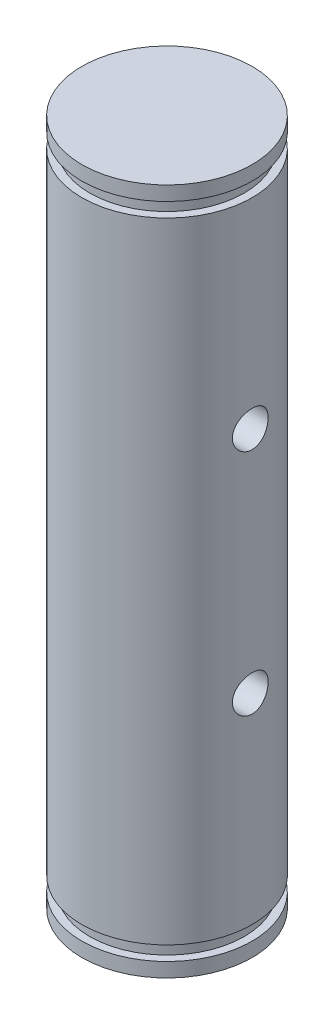
ISO-10303-21;
HEADER;
FILE_DESCRIPTION(('STEP AP214'),'2;1');
FILE_NAME('part.step','',(''),(''),'','','');
FILE_SCHEMA(('AUTOMOTIVE_DESIGN { 1 0 10303 214 1 1 1 1 }'));
ENDSEC;
DATA;
#1=APPLICATION_CONTEXT('core data for automotive mechanical design processes');
#2=APPLICATION_PROTOCOL_DEFINITION('international standard','automotive_design',2000,#1);
#3=PRODUCT_CONTEXT('',#1,'mechanical');
#4=PRODUCT('Part','Part','',(#3));
#5=PRODUCT_RELATED_PRODUCT_CATEGORY('part','',(#4));
#6=PRODUCT_DEFINITION_FORMATION('','',#4);
#7=PRODUCT_DEFINITION_CONTEXT('part definition',#1,'design');
#8=PRODUCT_DEFINITION('design','',#6,#7);
#9=PRODUCT_DEFINITION_SHAPE('','',#8);
#10=(LENGTH_UNIT() NAMED_UNIT(*) SI_UNIT(.MILLI.,.METRE.));
#11=(NAMED_UNIT(*) PLANE_ANGLE_UNIT() SI_UNIT($,.RADIAN.));
#12=(NAMED_UNIT(*) SI_UNIT($,.STERADIAN.) SOLID_ANGLE_UNIT());
#13=UNCERTAINTY_MEASURE_WITH_UNIT(LENGTH_MEASURE(1.E-05),#10,'distance_accuracy_value','');
#14=(GEOMETRIC_REPRESENTATION_CONTEXT(3) GLOBAL_UNCERTAINTY_ASSIGNED_CONTEXT((#13)) GLOBAL_UNIT_ASSIGNED_CONTEXT((#10,
#11,#12)) REPRESENTATION_CONTEXT('',''));
#15=CARTESIAN_POINT('',(0.,0.,0.));
#16=DIRECTION('',(0.,0.,1.));
#17=DIRECTION('',(1.,0.,0.));
#18=AXIS2_PLACEMENT_3D('',#15,#16,#17);
#19=CARTESIAN_POINT('',(5.9,22.,0.));
#20=DIRECTION('',(0.,-1.,0.));
#21=DIRECTION('',(0.,0.,-1.));
#22=AXIS2_PLACEMENT_3D('',#19,#20,#21);
#23=CYLINDRICAL_SURFACE('',#22,5.95);
#24=CARTESIAN_POINT('',(11.85,-9.24999999999999,0.));
#25=CARTESIAN_POINT('',(11.8499987153382,-9.24999754004047,0.0693956953655164));
#26=CARTESIAN_POINT('',(11.8487735466216,-9.24420156627658,0.138821751509415));
#27=CARTESIAN_POINT('',(11.8440043644741,-9.22119220251964,0.275706382210338));
#28=CARTESIAN_POINT('',(11.840458606665,-9.20397022350697,0.343163436798146));
#29=CARTESIAN_POINT('',(11.8314435789986,-9.15866845214247,0.474111605385649));
#30=CARTESIAN_POINT('',(11.825976240549,-9.13059955936681,0.537606626500025));
#31=CARTESIAN_POINT('',(11.8137101425684,-9.06443430158659,0.658982839089461));
#32=CARTESIAN_POINT('',(11.8069114384955,-9.02633835423675,0.716864264249039));
#33=CARTESIAN_POINT('',(11.7926160158276,-8.94060046943334,0.826234080578837));
#34=CARTESIAN_POINT('',(11.7851112042808,-8.89283811138539,0.877627021885693));
#35=CARTESIAN_POINT('',(11.7703072969242,-8.78938189067589,0.971733912262886));
#36=CARTESIAN_POINT('',(11.7630082183961,-8.73368736407563,1.01444713409597));
#37=CARTESIAN_POINT('',(11.7493627902317,-8.61525105823298,1.09039623647303));
#38=CARTESIAN_POINT('',(11.7430268316459,-8.55244365447685,1.12353181398773));
#39=CARTESIAN_POINT('',(11.7321406263203,-8.42199729567956,1.17874202614761));
#40=CARTESIAN_POINT('',(11.72759018374,-8.35435887148147,1.20081787393016));
#41=CARTESIAN_POINT('',(11.7208724064646,-8.2172019601525,1.23296914695504));
#42=CARTESIAN_POINT('',(11.7186716874704,-8.14772459034421,1.24321285677639));
#43=CARTESIAN_POINT('',(11.7168021657956,-8.00800521450646,1.25193207451158));
#44=CARTESIAN_POINT('',(11.717133076754,-7.93776329585514,1.25040891341482));
#45=CARTESIAN_POINT('',(11.7202591507824,-7.79975035896598,1.2357733506455));
#46=CARTESIAN_POINT('',(11.7230130043094,-7.73195766326761,1.22285521619703));
#47=CARTESIAN_POINT('',(11.7306094884041,-7.59952368016494,1.18610364727535));
#48=CARTESIAN_POINT('',(11.7354522279718,-7.53488255740836,1.1622696431987));
#49=CARTESIAN_POINT('',(11.7467222565326,-7.410034047135,1.10418117115188));
#50=CARTESIAN_POINT('',(11.753161002314,-7.34986299586313,1.06985092144845));
#51=CARTESIAN_POINT('',(11.7668903795003,-7.23606331740088,0.991797838354874));
#52=CARTESIAN_POINT('',(11.7741811184132,-7.18243551761368,0.948073819035569));
#53=CARTESIAN_POINT('',(11.7889710581436,-7.08212497808042,0.851440443878541));
#54=CARTESIAN_POINT('',(11.7964715200103,-7.03560169741097,0.798365602499095));
#55=CARTESIAN_POINT('',(11.8107033146364,-6.95209177157358,0.685083899585171));
#56=CARTESIAN_POINT('',(11.8174346354757,-6.91510527419435,0.624876927547272));
#57=CARTESIAN_POINT('',(11.829388970922,-6.85168412675179,0.498853660235408));
#58=CARTESIAN_POINT('',(11.8346091740341,-6.82526911087895,0.433027200481181));
#59=CARTESIAN_POINT('',(11.8429320120684,-6.78391834404366,0.297736355479883));
#60=CARTESIAN_POINT('',(11.8460349305661,-6.76898105579503,0.228272458749906));
#61=CARTESIAN_POINT('',(11.849733632017,-6.75123877159523,0.0890475295746652));
#62=CARTESIAN_POINT('',(11.8503744609292,-6.74821576713033,0.0193154406293779));
#63=CARTESIAN_POINT('',(11.8492024853284,-6.75379874454165,-0.119657356952811));
#64=CARTESIAN_POINT('',(11.8473898337147,-6.76240400175156,-0.188898095940033));
#65=CARTESIAN_POINT('',(11.8415428829358,-6.79081827719467,-0.32420934678009));
#66=CARTESIAN_POINT('',(11.8375310363386,-6.81051412105838,-0.390304680142879));
#67=CARTESIAN_POINT('',(11.827734276846,-6.86042577859997,-0.51825409570173));
#68=CARTESIAN_POINT('',(11.8219492212155,-6.89064243918137,-0.580107835978588));
#69=CARTESIAN_POINT('',(11.8091360645187,-6.96120041007304,-0.698728234388443));
#70=CARTESIAN_POINT('',(11.8020924235085,-7.00167129643861,-0.755416102818929));
#71=CARTESIAN_POINT('',(11.7875773141852,-7.09141692750371,-0.861274182483677));
#72=CARTESIAN_POINT('',(11.780105794976,-7.14069272103019,-0.910443496823097));
#73=CARTESIAN_POINT('',(11.7654231813342,-7.24764617152953,-1.00072102315753));
#74=CARTESIAN_POINT('',(11.7582186268587,-7.30545180985413,-1.04167886758319));
#75=CARTESIAN_POINT('',(11.7450307011578,-7.42724994974427,-1.11330493048569));
#76=CARTESIAN_POINT('',(11.7390472787168,-7.49124219167078,-1.14397358053761));
#77=CARTESIAN_POINT('',(11.7290332273974,-7.62326196609419,-1.19395226804462));
#78=CARTESIAN_POINT('',(11.7249919988423,-7.69126526744984,-1.21332408558698));
#79=CARTESIAN_POINT('',(11.7192991254102,-7.82965668961773,-1.24034342025902));
#80=CARTESIAN_POINT('',(11.7176471321291,-7.90004446118849,-1.24799264681468));
#81=CARTESIAN_POINT('',(11.7169405075937,-8.03969377458351,-1.25128134606294));
#82=CARTESIAN_POINT('',(11.7178343996896,-8.10894955855369,-1.24715883359295));
#83=CARTESIAN_POINT('',(11.722003071076,-8.2457564225835,-1.22754997088302));
#84=CARTESIAN_POINT('',(11.7252778266816,-8.31330751959451,-1.21206373368992));
#85=CARTESIAN_POINT('',(11.7338151182436,-8.44461616103176,-1.17027791481797));
#86=CARTESIAN_POINT('',(11.7390717547266,-8.50838432045273,-1.14401040542933));
#87=CARTESIAN_POINT('',(11.7509833029305,-8.63064476026253,-1.08143623592345));
#88=CARTESIAN_POINT('',(11.7576383471038,-8.68913654014011,-1.04512862473909));
#89=CARTESIAN_POINT('',(11.7717523927993,-8.80036282239534,-0.962704358741528));
#90=CARTESIAN_POINT('',(11.779224099423,-8.85296923400542,-0.916416997083355));
#91=CARTESIAN_POINT('',(11.7940415360467,-8.94974641908955,-0.815696242369271));
#92=CARTESIAN_POINT('',(11.801387236633,-8.99391524672642,-0.761260975430413));
#93=CARTESIAN_POINT('',(11.8152272554908,-9.07305798959989,-0.645018630061577));
#94=CARTESIAN_POINT('',(11.8217105391843,-9.10791759998119,-0.583132349158956));
#95=CARTESIAN_POINT('',(11.8329856056185,-9.16668580903975,-0.454258292749473));
#96=CARTESIAN_POINT('',(11.8377788565186,-9.19060391817959,-0.387275006913342));
#97=CARTESIAN_POINT('',(11.8442424828995,-9.22237200368475,-0.266820137053135));
#98=CARTESIAN_POINT('',(11.846388530237,-9.23271335466923,-0.214016906986997));
#99=CARTESIAN_POINT('',(11.8492677593804,-9.24652817464085,-0.107481832300639));
#100=CARTESIAN_POINT('',(11.8500009950272,-9.25000190534701,-0.0537500231464807));
#101=CARTESIAN_POINT('',(11.85,-9.24999999999999,0.));
#102=B_SPLINE_CURVE_WITH_KNOTS('',3,(#24,#25,#26,#27,#28,#29,#30,#31,#32,#33,#34,#35,#36,#37,
#38,#39,#40,#41,#42,#43,#44,#45,#46,#47,#48,#49,#50,#51,#52,#53,#54,#55,#56,#57,#58,#59,#60,#61,
#62,#63,#64,#65,#66,#67,#68,#69,#70,#71,#72,#73,#74,#75,#76,#77,#78,#79,#80,#81,#82,#83,#84,#85,
#86,#87,#88,#89,#90,#91,#92,#93,#94,#95,#96,#97,#98,#99,#100,#101),.UNSPECIFIED.,.T.,.F.,(4,2,2,
2,2,2,2,2,2,2,2,2,2,2,2,2,2,2,2,2,2,2,2,2,2,2,2,2,2,2,2,2,2,2,2,2,2,2,4),(0.,0.207990393469132,
0.416137312396148,0.624075615439081,0.83200525864293,1.0427051847416,1.25342275723034,
1.46627315599071,1.67910020216065,1.88886148747252,2.09859904634427,2.30482854439066,
2.51106880497103,2.71883474057864,2.92662692130715,3.13855451513833,3.35048539295141,
3.5628080789163,3.77510232217366,3.98349343961787,4.19187157085113,4.39816086093998,
4.60446676072116,4.81352235596107,5.02260287020177,5.23521881674873,5.44782584411124,
5.65925899067696,5.87066130244566,6.07781968191666,6.28497600059504,6.49152048330846,
6.69808453803413,6.90851070846,7.11898534798169,7.33193649048662,7.54470218036627,
7.70580604234675,7.86690376468135),.UNSPECIFIED.);
#103=CARTESIAN_POINT('',(11.85,-9.24999999999999,0.));
#104=VERTEX_POINT('',#103);
#105=EDGE_CURVE('E10',#104,#104,#102,.T.);
#106=ORIENTED_EDGE('',*,*,#105,.T.);
#107=EDGE_LOOP('',(#106));
#108=FACE_BOUND('',#107,.T.);
#109=CARTESIAN_POINT('',(0.0827841711004045,-8.,1.24999999999999));
#110=CARTESIAN_POINT('',(0.0827827741816372,-8.06937664511744,1.24999752591331));
#111=CARTESIAN_POINT('',(0.0815295763005372,-8.13878368731504,1.24420462598867));
#112=CARTESIAN_POINT('',(0.0766605244883268,-8.27562884416079,1.22120857727258));
#113=CARTESIAN_POINT('',(0.0730428765522212,-8.34306542311633,1.20399676433511));
#114=CARTESIAN_POINT('',(0.0638723155298173,-8.47397021583026,1.15872471128137));
#115=CARTESIAN_POINT('',(0.0583214325083894,-8.53744251029927,1.13067584764454));
#116=CARTESIAN_POINT('',(0.0459122743643719,-8.65878037123384,1.06455781135334));
#117=CARTESIAN_POINT('',(0.0390540477819397,-8.71664614574274,1.02648901070769));
#118=CARTESIAN_POINT('',(0.024683485035558,-8.82603249856261,0.940779024640832));
#119=CARTESIAN_POINT('',(0.0171633372487668,-8.87745293171851,0.893011318591508));
#120=CARTESIAN_POINT('',(0.00238482158325133,-8.97161320580062,0.789532713268309));
#121=CARTESIAN_POINT('',(-0.00487352687648962,-9.01435240388016,0.733821226275876));
#122=CARTESIAN_POINT('',(-0.0183953156340287,-9.09032960063754,0.61536893750651));
#123=CARTESIAN_POINT('',(-0.0246484666528053,-9.12347181904193,0.552565425273846));
#124=CARTESIAN_POINT('',(-0.035367290438799,-9.17869536785763,0.422127471924095));
#125=CARTESIAN_POINT('',(-0.0398331480086841,-9.2007778418844,0.354493531116584));
#126=CARTESIAN_POINT('',(-0.0464190085655683,-9.23294160165647,0.217354987634057));
#127=CARTESIAN_POINT('',(-0.0485720762248401,-9.24319220400918,0.147891710103824));
#128=CARTESIAN_POINT('',(-0.050404152594181,-9.25193009634145,0.00820027083964121));
#129=CARTESIAN_POINT('',(-0.0500834232828442,-9.25041863194034,-0.0620278091140863));
#130=CARTESIAN_POINT('',(-0.0470294788070798,-9.23580249349488,-0.200089892190529));
#131=CARTESIAN_POINT('',(-0.0443342307405257,-9.22288026312864,-0.267944172735163));
#132=CARTESIAN_POINT('',(-0.0368771342446292,-9.18609949990559,-0.400499169181494));
#133=CARTESIAN_POINT('',(-0.0321151972817472,-9.1622404985331,-0.465199749851808));
#134=CARTESIAN_POINT('',(-0.0209979988923096,-9.10409849423761,-0.590123801408471));
#135=CARTESIAN_POINT('',(-0.0146320521382791,-9.0697452427908,-0.650313587494412));
#136=CARTESIAN_POINT('',(-0.00100664141044637,-8.99164208966915,-0.764141171731798));
#137=CARTESIAN_POINT('',(0.00625293536919558,-8.94789100115422,-0.817778140993509));
#138=CARTESIAN_POINT('',(0.0210302288728472,-8.85123721036716,-0.918061543817206));
#139=CARTESIAN_POINT('',(0.028550225436599,-8.79817482572759,-0.964553865474922));
#140=CARTESIAN_POINT('',(0.0428693671310993,-8.68492947637429,-1.04800709735008));
#141=CARTESIAN_POINT('',(0.0496684956530091,-8.62474634766581,-1.08496778798631));
#142=CARTESIAN_POINT('',(0.0617814058621144,-8.49873191169354,-1.14836976563448));
#143=CARTESIAN_POINT('',(0.0670913442080242,-8.43288655252564,-1.1747839068499));
#144=CARTESIAN_POINT('',(0.0755700296973972,-8.29755429574095,-1.21612725161445));
#145=CARTESIAN_POINT('',(0.0787390876064683,-8.22806792822373,-1.23105812209409));
#146=CARTESIAN_POINT('',(0.0825143371384057,-8.08882892245288,-1.24877617733522));
#147=CARTESIAN_POINT('',(0.0831676962749932,-8.01910597401327,-1.25178688719763));
#148=CARTESIAN_POINT('',(0.081964513022462,-7.88015431019792,-1.24618259014453));
#149=CARTESIAN_POINT('',(0.0801081287291602,-7.81092556396713,-1.23756831551963));
#150=CARTESIAN_POINT('',(0.0741389933675948,-7.67569297566968,-1.209151940309));
#151=CARTESIAN_POINT('',(0.0700507342091939,-7.60966244992415,-1.18947121052081));
#152=CARTESIAN_POINT('',(0.0601002947301713,-7.48183603533535,-1.13961122638657));
#153=CARTESIAN_POINT('',(0.0542379556164587,-7.42004052616446,-1.10943103222571));
#154=CARTESIAN_POINT('',(0.0412951617143171,-7.30146588899808,-1.03892999762512));
#155=CARTESIAN_POINT('',(0.0341985001915024,-7.2447710444578,-0.998470436983858));
#156=CARTESIAN_POINT('',(0.0196302230798737,-7.13889369889731,-0.908742277518977));
#157=CARTESIAN_POINT('',(0.0121585647759955,-7.08971205628145,-0.859472673516967));
#158=CARTESIAN_POINT('',(-0.00247219207682435,-6.99939910308154,-0.75251529516465));
#159=CARTESIAN_POINT('',(-0.00962377499596116,-6.95841959569432,-0.694698142206413));
#160=CARTESIAN_POINT('',(-0.0226739789426241,-6.88675555385836,-0.572870342715779));
#161=CARTESIAN_POINT('',(-0.0285726558811342,-6.85607055998108,-0.508859972741582));
#162=CARTESIAN_POINT('',(-0.0384205425970406,-6.80608266261267,-0.37684462906449));
#163=CARTESIAN_POINT('',(-0.0423815003427287,-6.78671102627699,-0.308866596967034));
#164=CARTESIAN_POINT('',(-0.0479582632305641,-6.75968352621457,-0.170529177265812));
#165=CARTESIAN_POINT('',(-0.0495743815516959,-6.75202609791962,-0.100170108960293));
#166=CARTESIAN_POINT('',(-0.0502709668563961,-6.74871014048756,0.0394869229400634));
#167=CARTESIAN_POINT('',(-0.049399485586267,-6.75282423037155,0.108779347099478));
#168=CARTESIAN_POINT('',(-0.0453208349788166,-6.77242901403667,0.245661756178848));
#169=CARTESIAN_POINT('',(-0.0421137014681096,-6.78791953331456,0.313251767195698));
#170=CARTESIAN_POINT('',(-0.0337266273620823,-6.82973214275798,0.444650927535584));
#171=CARTESIAN_POINT('',(-0.0285521422620869,-6.85602429592894,0.50846997339209));
#172=CARTESIAN_POINT('',(-0.0167850617805014,-6.9186637089751,0.630822142216147));
#173=CARTESIAN_POINT('',(-0.0101923405387139,-6.9550118613436,0.689354795392146));
#174=CARTESIAN_POINT('',(0.00383522015014998,-7.03748501013702,0.800589047642535));
#175=CARTESIAN_POINT('',(0.0112828686216424,-7.08377123649565,0.853169501901491));
#176=CARTESIAN_POINT('',(0.026108621414563,-7.18447850552478,0.949894846432468));
#177=CARTESIAN_POINT('',(0.0334867087022686,-7.2389014883579,0.994037719076496));
#178=CARTESIAN_POINT('',(0.0474370847294813,-7.35512997760743,1.07314713282747));
#179=CARTESIAN_POINT('',(0.053998522170679,-7.41701697329195,1.10799595975786));
#180=CARTESIAN_POINT('',(0.0654381799490583,-7.54589144617727,1.16674382009691));
#181=CARTESIAN_POINT('',(0.0703178726018246,-7.61287439897737,1.19065243736224));
#182=CARTESIAN_POINT('',(0.0769051943319911,-7.73330513954682,1.22239811693472));
#183=CARTESIAN_POINT('',(0.0790956418192035,-7.78608317529391,1.23272960995623));
#184=CARTESIAN_POINT('',(0.0820356411307353,-7.89256809022215,1.24653136680016));
#185=CARTESIAN_POINT('',(0.0827852528701769,-7.94627493068655,1.25000191592542));
#186=CARTESIAN_POINT('',(0.0827841711004045,-8.,1.24999999999999));
#187=B_SPLINE_CURVE_WITH_KNOTS('',3,(#109,#110,#111,#112,#113,#114,#115,#116,#117,#118,#119,
#120,#121,#122,#123,#124,#125,#126,#127,#128,#129,#130,#131,#132,#133,#134,#135,#136,#137,#138,
#139,#140,#141,#142,#143,#144,#145,#146,#147,#148,#149,#150,#151,#152,#153,#154,#155,#156,#157,
#158,#159,#160,#161,#162,#163,#164,#165,#166,#167,#168,#169,#170,#171,#172,#173,#174,#175,#176,
#177,#178,#179,#180,#181,#182,#183,#184,#185,#186),.UNSPECIFIED.,.T.,.F.,(4,2,2,2,2,2,2,2,2,2,2,
2,2,2,2,2,2,2,2,2,2,2,2,2,2,2,2,2,2,2,2,2,2,2,2,2,2,2,4),(0.,0.207933126641628,
0.416024204090547,0.623897423402626,0.831762926124764,1.04253778168445,1.25332823946591,
1.46615514643905,1.67896004183483,1.8886803485904,2.09837844597417,2.30478324334088,
2.51119688362117,2.71902371398579,2.92687680596572,3.13872345345517,3.35057498084268,
3.56296833174743,3.77533084546094,3.98369175794718,4.19203954580344,4.39814564976909,
4.60427020719291,4.81333969105404,5.02243304385279,5.23509676434955,5.44775099272378,
5.65909945415657,5.87041968508845,6.07768572793048,6.2849485915817,6.491640855308,
6.69835146934139,6.90871032866819,7.11911942708318,7.33207894451385,7.54485154602782,
7.70588104221253,7.86690384206791),.UNSPECIFIED.);
#188=CARTESIAN_POINT('',(0.0827841711004045,-8.,1.24999999999999));
#189=VERTEX_POINT('',#188);
#190=EDGE_CURVE('E47',#189,#189,#187,.T.);
#191=ORIENTED_EDGE('',*,*,#190,.T.);
#192=EDGE_LOOP('',(#191));
#193=FACE_BOUND('',#192,.T.);
#194=CARTESIAN_POINT('',(11.85,6.75000000000001,0.));
#195=CARTESIAN_POINT('',(11.8499987153382,6.75000245995953,0.0693956953655164));
#196=CARTESIAN_POINT('',(11.8487735466216,6.75579843372342,0.138821751509416));
#197=CARTESIAN_POINT('',(11.8440043644741,6.77880779748036,0.275706382210338));
#198=CARTESIAN_POINT('',(11.840458606665,6.79602977649303,0.343163436798146));
#199=CARTESIAN_POINT('',(11.8314435789986,6.84133154785753,0.474111605385649));
#200=CARTESIAN_POINT('',(11.825976240549,6.86940044063318,0.537606626500025));
#201=CARTESIAN_POINT('',(11.8137101425684,6.93556569841341,0.658982839089461));
#202=CARTESIAN_POINT('',(11.8069114384955,6.97366164576325,0.716864264249039));
#203=CARTESIAN_POINT('',(11.7926160158276,7.05939953056666,0.826234080578837));
#204=CARTESIAN_POINT('',(11.7851112042808,7.10716188861461,0.877627021885693));
#205=CARTESIAN_POINT('',(11.7703072969242,7.21061810932411,0.971733912262886));
#206=CARTESIAN_POINT('',(11.7630082183961,7.26631263592437,1.01444713409597));
#207=CARTESIAN_POINT('',(11.7493627902317,7.38474894176702,1.09039623647304));
#208=CARTESIAN_POINT('',(11.7430268316459,7.44755634552315,1.12353181398773));
#209=CARTESIAN_POINT('',(11.7321406263203,7.57800270432044,1.17874202614761));
#210=CARTESIAN_POINT('',(11.72759018374,7.64564112851853,1.20081787393016));
#211=CARTESIAN_POINT('',(11.7208724064646,7.7827980398475,1.23296914695504));
#212=CARTESIAN_POINT('',(11.7186716874704,7.85227540965579,1.24321285677639));
#213=CARTESIAN_POINT('',(11.7168021657956,7.99199478549354,1.25193207451158));
#214=CARTESIAN_POINT('',(11.717133076754,8.06223670414486,1.25040891341482));
#215=CARTESIAN_POINT('',(11.7202591507824,8.20024964103402,1.2357733506455));
#216=CARTESIAN_POINT('',(11.7230130043094,8.26804233673239,1.22285521619703));
#217=CARTESIAN_POINT('',(11.7306094884041,8.40047631983506,1.18610364727535));
#218=CARTESIAN_POINT('',(11.7354522279718,8.46511744259164,1.16226964319871));
#219=CARTESIAN_POINT('',(11.7467222565326,8.589965952865,1.10418117115188));
#220=CARTESIAN_POINT('',(11.753161002314,8.65013700413687,1.06985092144845));
#221=CARTESIAN_POINT('',(11.7668903795003,8.76393668259912,0.991797838354874));
#222=CARTESIAN_POINT('',(11.7741811184132,8.81756448238632,0.94807381903557));
#223=CARTESIAN_POINT('',(11.7889710581436,8.91787502191958,0.851440443878541));
#224=CARTESIAN_POINT('',(11.7964715200103,8.96439830258903,0.798365602499095));
#225=CARTESIAN_POINT('',(11.8107033146364,9.04790822842642,0.685083899585171));
#226=CARTESIAN_POINT('',(11.8174346354757,9.08489472580565,0.624876927547272));
#227=CARTESIAN_POINT('',(11.829388970922,9.14831587324821,0.498853660235409));
#228=CARTESIAN_POINT('',(11.8346091740341,9.17473088912105,0.433027200481181));
#229=CARTESIAN_POINT('',(11.8429320120684,9.21608165595634,0.297736355479883));
#230=CARTESIAN_POINT('',(11.8460349305661,9.23101894420497,0.228272458749907));
#231=CARTESIAN_POINT('',(11.849733632017,9.24876122840478,0.0890475295746662));
#232=CARTESIAN_POINT('',(11.8503744609292,9.25178423286967,0.0193154406293788));
#233=CARTESIAN_POINT('',(11.8492024853284,9.24620125545835,-0.11965735695281));
#234=CARTESIAN_POINT('',(11.8473898337147,9.23759599824844,-0.188898095940032));
#235=CARTESIAN_POINT('',(11.8415428829358,9.20918172280533,-0.324209346780089));
#236=CARTESIAN_POINT('',(11.8375310363386,9.18948587894162,-0.390304680142879));
#237=CARTESIAN_POINT('',(11.827734276846,9.13957422140003,-0.51825409570173));
#238=CARTESIAN_POINT('',(11.8219492212155,9.10935756081864,-0.580107835978588));
#239=CARTESIAN_POINT('',(11.8091360645187,9.03879958992696,-0.698728234388442));
#240=CARTESIAN_POINT('',(11.8020924235085,8.99832870356139,-0.755416102818929));
#241=CARTESIAN_POINT('',(11.7875773141852,8.90858307249629,-0.861274182483677));
#242=CARTESIAN_POINT('',(11.780105794976,8.85930727896981,-0.910443496823097));
#243=CARTESIAN_POINT('',(11.7654231813342,8.75235382847047,-1.00072102315753));
#244=CARTESIAN_POINT('',(11.7582186268587,8.69454819014588,-1.04167886758319));
#245=CARTESIAN_POINT('',(11.7450307011578,8.57275005025573,-1.11330493048569));
#246=CARTESIAN_POINT('',(11.7390472787168,8.50875780832923,-1.14397358053761));
#247=CARTESIAN_POINT('',(11.7290332273974,8.37673803390581,-1.19395226804462));
#248=CARTESIAN_POINT('',(11.7249919988423,8.30873473255016,-1.21332408558698));
#249=CARTESIAN_POINT('',(11.7192991254102,8.17034331038227,-1.24034342025902));
#250=CARTESIAN_POINT('',(11.7176471321291,8.09995553881152,-1.24799264681468));
#251=CARTESIAN_POINT('',(11.7169405075937,7.96030622541649,-1.25128134606294));
#252=CARTESIAN_POINT('',(11.7178343996896,7.89105044144631,-1.24715883359295));
#253=CARTESIAN_POINT('',(11.722003071076,7.7542435774165,-1.22754997088302));
#254=CARTESIAN_POINT('',(11.7252778266816,7.68669248040549,-1.21206373368992));
#255=CARTESIAN_POINT('',(11.7338151182436,7.55538383896824,-1.17027791481798));
#256=CARTESIAN_POINT('',(11.7390717547266,7.49161567954727,-1.14401040542933));
#257=CARTESIAN_POINT('',(11.7509833029305,7.36935523973747,-1.08143623592345));
#258=CARTESIAN_POINT('',(11.7576383471038,7.31086345985989,-1.04512862473909));
#259=CARTESIAN_POINT('',(11.7717523927993,7.19963717760466,-0.962704358741528));
#260=CARTESIAN_POINT('',(11.779224099423,7.14703076599458,-0.916416997083355));
#261=CARTESIAN_POINT('',(11.7940415360467,7.05025358091045,-0.815696242369271));
#262=CARTESIAN_POINT('',(11.801387236633,7.00608475327358,-0.761260975430413));
#263=CARTESIAN_POINT('',(11.8152272554908,6.92694201040011,-0.645018630061578));
#264=CARTESIAN_POINT('',(11.8217105391843,6.89208240001882,-0.583132349158958));
#265=CARTESIAN_POINT('',(11.8329856056185,6.83331419096025,-0.454258292749476));
#266=CARTESIAN_POINT('',(11.8377788565186,6.80939608182041,-0.387275006913344));
#267=CARTESIAN_POINT('',(11.8442424828995,6.77762799631525,-0.266820137053137));
#268=CARTESIAN_POINT('',(11.846388530237,6.76728664533077,-0.214016906986999));
#269=CARTESIAN_POINT('',(11.8492677593804,6.75347182535915,-0.10748183230064));
#270=CARTESIAN_POINT('',(11.8500009950272,6.74999809465299,-0.0537500231464811));
#271=CARTESIAN_POINT('',(11.85,6.75000000000001,0.));
#272=B_SPLINE_CURVE_WITH_KNOTS('',3,(#194,#195,#196,#197,#198,#199,#200,#201,#202,#203,#204,
#205,#206,#207,#208,#209,#210,#211,#212,#213,#214,#215,#216,#217,#218,#219,#220,#221,#222,#223,
#224,#225,#226,#227,#228,#229,#230,#231,#232,#233,#234,#235,#236,#237,#238,#239,#240,#241,#242,
#243,#244,#245,#246,#247,#248,#249,#250,#251,#252,#253,#254,#255,#256,#257,#258,#259,#260,#261,
#262,#263,#264,#265,#266,#267,#268,#269,#270,#271),.UNSPECIFIED.,.T.,.F.,(4,2,2,2,2,2,2,2,2,2,2,
2,2,2,2,2,2,2,2,2,2,2,2,2,2,2,2,2,2,2,2,2,2,2,2,2,2,2,4),(0.,0.207990393469132,
0.416137312396148,0.624075615439081,0.832005258642929,1.0427051847416,1.25342275723034,
1.46627315599071,1.67910020216065,1.88886148747252,2.09859904634427,2.30482854439066,
2.51106880497103,2.71883474057864,2.92662692130715,3.13855451513833,3.35048539295141,
3.5628080789163,3.77510232217366,3.98349343961787,4.19187157085114,4.39816086093998,
4.60446676072116,4.81352235596107,5.02260287020177,5.23521881674872,5.44782584411124,
5.65925899067696,5.87066130244566,6.07781968191666,6.28497600059504,6.49152048330846,
6.69808453803413,6.90851070846,7.11898534798169,7.33193649048662,7.54470218036627,
7.70580604234675,7.86690376468136),.UNSPECIFIED.);
#273=CARTESIAN_POINT('',(11.85,6.75000000000001,0.));
#274=VERTEX_POINT('',#273);
#275=EDGE_CURVE('E51',#274,#274,#272,.T.);
#276=ORIENTED_EDGE('',*,*,#275,.T.);
#277=EDGE_LOOP('',(#276));
#278=FACE_BOUND('',#277,.T.);
#279=CARTESIAN_POINT('',(0.0827841711004045,8.,1.24999999999999));
#280=CARTESIAN_POINT('',(0.0827827741816374,7.93062335488256,1.24999752591331));
#281=CARTESIAN_POINT('',(0.081529576300538,7.86121631268497,1.24420462598867));
#282=CARTESIAN_POINT('',(0.0766605244883277,7.72437115583921,1.22120857727258));
#283=CARTESIAN_POINT('',(0.0730428765522214,7.65693457688367,1.20399676433511));
#284=CARTESIAN_POINT('',(0.0638723155298171,7.52602978416974,1.15872471128137));
#285=CARTESIAN_POINT('',(0.0583214325083895,7.46255748970073,1.13067584764454));
#286=CARTESIAN_POINT('',(0.045912274364372,7.34121962876616,1.06455781135334));
#287=CARTESIAN_POINT('',(0.0390540477819396,7.28335385425727,1.02648901070769));
#288=CARTESIAN_POINT('',(0.0246834850355582,7.17396750143739,0.940779024640833));
#289=CARTESIAN_POINT('',(0.0171633372487675,7.12254706828149,0.893011318591509));
#290=CARTESIAN_POINT('',(0.00238482158325151,7.02838679419938,0.78953271326831));
#291=CARTESIAN_POINT('',(-0.00487352687649042,6.98564759611984,0.733821226275877));
#292=CARTESIAN_POINT('',(-0.0183953156340295,6.90967039936246,0.615368937506511));
#293=CARTESIAN_POINT('',(-0.0246484666528052,6.87652818095807,0.552565425273847));
#294=CARTESIAN_POINT('',(-0.0353672904387984,6.82130463214237,0.422127471924095));
#295=CARTESIAN_POINT('',(-0.039833148008684,6.7992221581156,0.354493531116585));
#296=CARTESIAN_POINT('',(-0.0464190085655685,6.76705839834353,0.217354987634058));
#297=CARTESIAN_POINT('',(-0.0485720762248399,6.75680779599082,0.147891710103825));
#298=CARTESIAN_POINT('',(-0.050404152594181,6.74806990365855,0.00820027083964224));
#299=CARTESIAN_POINT('',(-0.0500834232828444,6.74958136805966,-0.0620278091140852));
#300=CARTESIAN_POINT('',(-0.0470294788070797,6.76419750650512,-0.200089892190528));
#301=CARTESIAN_POINT('',(-0.044334230740525,6.77711973687136,-0.267944172735162));
#302=CARTESIAN_POINT('',(-0.0368771342446285,6.81390050009441,-0.400499169181493));
#303=CARTESIAN_POINT('',(-0.0321151972817471,6.8377595014669,-0.465199749851807));
#304=CARTESIAN_POINT('',(-0.02099799889231,6.89590150576239,-0.59012380140847));
#305=CARTESIAN_POINT('',(-0.0146320521382793,6.9302547572092,-0.650313587494411));
#306=CARTESIAN_POINT('',(-0.00100664141044639,7.00835791033085,-0.764141171731798));
#307=CARTESIAN_POINT('',(0.00625293536919555,7.05210899884578,-0.817778140993509));
#308=CARTESIAN_POINT('',(0.021030228872847,7.14876278963284,-0.918061543817205));
#309=CARTESIAN_POINT('',(0.0285502254365987,7.20182517427241,-0.964553865474922));
#310=CARTESIAN_POINT('',(0.0428693671310991,7.31507052362571,-1.04800709735008));
#311=CARTESIAN_POINT('',(0.0496684956530089,7.37525365233419,-1.08496778798631));
#312=CARTESIAN_POINT('',(0.0617814058621143,7.50126808830646,-1.14836976563448));
#313=CARTESIAN_POINT('',(0.0670913442080241,7.56711344747437,-1.1747839068499));
#314=CARTESIAN_POINT('',(0.075570029697397,7.70244570425905,-1.21612725161445));
#315=CARTESIAN_POINT('',(0.0787390876064682,7.77193207177627,-1.23105812209409));
#316=CARTESIAN_POINT('',(0.0825143371384057,7.91117107754712,-1.24877617733522));
#317=CARTESIAN_POINT('',(0.0831676962749932,7.98089402598673,-1.25178688719763));
#318=CARTESIAN_POINT('',(0.081964513022462,8.11984568980208,-1.24618259014453));
#319=CARTESIAN_POINT('',(0.0801081287291602,8.18907443603287,-1.23756831551963));
#320=CARTESIAN_POINT('',(0.0741389933675948,8.32430702433032,-1.209151940309));
#321=CARTESIAN_POINT('',(0.0700507342091938,8.39033755007586,-1.18947121052081));
#322=CARTESIAN_POINT('',(0.0601002947301711,8.51816396466465,-1.13961122638657));
#323=CARTESIAN_POINT('',(0.0542379556164586,8.57995947383554,-1.10943103222571));
#324=CARTESIAN_POINT('',(0.0412951617143169,8.69853411100192,-1.03892999762512));
#325=CARTESIAN_POINT('',(0.0341985001915023,8.7552289555422,-0.998470436983857));
#326=CARTESIAN_POINT('',(0.0196302230798737,8.86110630110269,-0.908742277518977));
#327=CARTESIAN_POINT('',(0.0121585647759956,8.91028794371855,-0.859472673516967));
#328=CARTESIAN_POINT('',(-0.00247219207682422,9.00060089691846,-0.752515295164651));
#329=CARTESIAN_POINT('',(-0.00962377499596108,9.04158040430569,-0.694698142206414));
#330=CARTESIAN_POINT('',(-0.0226739789426241,9.11324444614165,-0.57287034271578));
#331=CARTESIAN_POINT('',(-0.0285726558811343,9.14392944001892,-0.508859972741582));
#332=CARTESIAN_POINT('',(-0.0384205425970407,9.19391733738733,-0.37684462906449));
#333=CARTESIAN_POINT('',(-0.0423815003427288,9.21328897372301,-0.308866596967034));
#334=CARTESIAN_POINT('',(-0.0479582632305642,9.24031647378543,-0.170529177265813));
#335=CARTESIAN_POINT('',(-0.049574381551696,9.24797390208038,-0.100170108960293));
#336=CARTESIAN_POINT('',(-0.0502709668563961,9.25128985951245,0.0394869229400627));
#337=CARTESIAN_POINT('',(-0.049399485586267,9.24717576962845,0.108779347099477));
#338=CARTESIAN_POINT('',(-0.0453208349788166,9.22757098596333,0.245661756178847));
#339=CARTESIAN_POINT('',(-0.0421137014681096,9.21208046668544,0.313251767195697));
#340=CARTESIAN_POINT('',(-0.0337266273620825,9.17026785724203,0.444650927535583));
#341=CARTESIAN_POINT('',(-0.0285521422620872,9.14397570407106,0.508469973392089));
#342=CARTESIAN_POINT('',(-0.0167850617805016,9.0813362910249,0.630822142216146));
#343=CARTESIAN_POINT('',(-0.0101923405387139,9.0449881386564,0.689354795392145));
#344=CARTESIAN_POINT('',(0.00383522015014977,8.96251498986298,0.800589047642535));
#345=CARTESIAN_POINT('',(0.0112828686216419,8.91622876350435,0.853169501901491));
#346=CARTESIAN_POINT('',(0.0261086214145628,8.81552149447522,0.949894846432469));
#347=CARTESIAN_POINT('',(0.0334867087022691,8.7610985116421,0.994037719076496));
#348=CARTESIAN_POINT('',(0.0474370847294822,8.64487002239257,1.07314713282747));
#349=CARTESIAN_POINT('',(0.0539985221706797,8.58298302670805,1.10799595975786));
#350=CARTESIAN_POINT('',(0.0654381799490586,8.45410855382273,1.16674382009691));
#351=CARTESIAN_POINT('',(0.0703178726018245,8.38712560102264,1.19065243736224));
#352=CARTESIAN_POINT('',(0.076905194331991,8.26669486045318,1.22239811693472));
#353=CARTESIAN_POINT('',(0.0790956418192034,8.21391682470609,1.23272960995623));
#354=CARTESIAN_POINT('',(0.0820356411307352,8.10743190977785,1.24653136680016));
#355=CARTESIAN_POINT('',(0.0827852528701767,8.05372506931345,1.25000191592542));
#356=CARTESIAN_POINT('',(0.0827841711004045,8.,1.24999999999999));
#357=B_SPLINE_CURVE_WITH_KNOTS('',3,(#279,#280,#281,#282,#283,#284,#285,#286,#287,#288,#289,
#290,#291,#292,#293,#294,#295,#296,#297,#298,#299,#300,#301,#302,#303,#304,#305,#306,#307,#308,
#309,#310,#311,#312,#313,#314,#315,#316,#317,#318,#319,#320,#321,#322,#323,#324,#325,#326,#327,
#328,#329,#330,#331,#332,#333,#334,#335,#336,#337,#338,#339,#340,#341,#342,#343,#344,#345,#346,
#347,#348,#349,#350,#351,#352,#353,#354,#355,#356),.UNSPECIFIED.,.T.,.F.,(4,2,2,2,2,2,2,2,2,2,2,
2,2,2,2,2,2,2,2,2,2,2,2,2,2,2,2,2,2,2,2,2,2,2,2,2,2,2,4),(0.,0.207933126641629,
0.416024204090546,0.623897423402626,0.831762926124763,1.04253778168445,1.25332823946591,
1.46615514643905,1.67896004183483,1.8886803485904,2.09837844597416,2.30478324334088,
2.51119688362117,2.71902371398579,2.92687680596572,3.13872345345517,3.35057498084268,
3.56296833174743,3.77533084546094,3.98369175794718,4.19203954580344,4.39814564976909,
4.60427020719292,4.81333969105404,5.02243304385279,5.23509676434955,5.44775099272378,
5.65909945415657,5.87041968508845,6.07768572793049,6.2849485915817,6.49164085530799,
6.69835146934139,6.90871032866819,7.11911942708318,7.33207894451385,7.54485154602783,
7.70588104221253,7.86690384206791),.UNSPECIFIED.);
#358=CARTESIAN_POINT('',(0.0827841711004045,8.,1.24999999999999));
#359=VERTEX_POINT('',#358);
#360=EDGE_CURVE('E55',#359,#359,#357,.T.);
#361=ORIENTED_EDGE('',*,*,#360,.T.);
#362=EDGE_LOOP('',(#361));
#363=FACE_BOUND('',#362,.T.);
#364=CARTESIAN_POINT('',(5.9,22.,0.));
#365=DIRECTION('',(0.,1.,0.));
#366=DIRECTION('',(0.,0.,1.));
#367=AXIS2_PLACEMENT_3D('',#364,#365,#366);
#368=CIRCLE('',#367,5.95);
#369=CARTESIAN_POINT('',(5.9,22.,5.95));
#370=VERTEX_POINT('',#369);
#371=EDGE_CURVE('E84',#370,#370,#368,.T.);
#372=ORIENTED_EDGE('',*,*,#371,.F.);
#373=EDGE_LOOP('',(#372));
#374=FACE_BOUND('',#373,.T.);
#375=CARTESIAN_POINT('',(5.9,-22.,0.));
#376=DIRECTION('',(0.,1.,0.));
#377=DIRECTION('',(0.,0.,1.));
#378=AXIS2_PLACEMENT_3D('',#375,#376,#377);
#379=CIRCLE('',#378,5.95);
#380=CARTESIAN_POINT('',(5.9,-22.,5.95));
#381=VERTEX_POINT('',#380);
#382=EDGE_CURVE('E97',#381,#381,#379,.T.);
#383=ORIENTED_EDGE('',*,*,#382,.T.);
#384=EDGE_LOOP('',(#383));
#385=FACE_BOUND('',#384,.T.);
#386=ADVANCED_FACE('F37',(#108,#193,#278,#363,#374,#385),#23,.T.);
#387=CARTESIAN_POINT('',(5.9,22.,0.));
#388=DIRECTION('',(0.,1.,0.));
#389=DIRECTION('',(0.,0.,1.));
#390=AXIS2_PLACEMENT_3D('',#387,#388,#389);
#391=PLANE('',#390);
#392=CARTESIAN_POINT('',(5.9,22.,0.));
#393=DIRECTION('',(0.,1.,0.));
#394=DIRECTION('',(0.,0.,1.));
#395=AXIS2_PLACEMENT_3D('',#392,#393,#394);
#396=CIRCLE('',#395,5.4);
#397=CARTESIAN_POINT('',(5.9,22.,5.4));
#398=VERTEX_POINT('',#397);
#399=EDGE_CURVE('E88',#398,#398,#396,.T.);
#400=ORIENTED_EDGE('',*,*,#399,.F.);
#401=EDGE_LOOP('',(#400));
#402=FACE_BOUND('',#401,.T.);
#403=ORIENTED_EDGE('',*,*,#371,.T.);
#404=EDGE_LOOP('',(#403));
#405=FACE_BOUND('',#404,.T.);
#406=ADVANCED_FACE('F124',(#402,#405),#391,.T.);
#407=CARTESIAN_POINT('',(5.9,23.,0.));
#408=DIRECTION('',(0.,-1.,0.));
#409=DIRECTION('',(0.,0.,-1.));
#410=AXIS2_PLACEMENT_3D('',#407,#408,#409);
#411=CYLINDRICAL_SURFACE('',#410,5.4);
#412=CARTESIAN_POINT('',(5.9,23.,0.));
#413=DIRECTION('',(0.,1.,0.));
#414=DIRECTION('',(0.,0.,1.));
#415=AXIS2_PLACEMENT_3D('',#412,#413,#414);
#416=CIRCLE('',#415,5.4);
#417=CARTESIAN_POINT('',(5.9,23.,5.4));
#418=VERTEX_POINT('',#417);
#419=EDGE_CURVE('E87',#418,#418,#416,.T.);
#420=ORIENTED_EDGE('',*,*,#419,.F.);
#421=EDGE_LOOP('',(#420));
#422=FACE_BOUND('',#421,.T.);
#423=ORIENTED_EDGE('',*,*,#399,.T.);
#424=EDGE_LOOP('',(#423));
#425=FACE_BOUND('',#424,.T.);
#426=ADVANCED_FACE('F128',(#422,#425),#411,.T.);
#427=CARTESIAN_POINT('',(5.9,24.,0.));
#428=DIRECTION('',(0.,-1.,0.));
#429=DIRECTION('',(0.,0.,-1.));
#430=AXIS2_PLACEMENT_3D('',#427,#428,#429);
#431=CYLINDRICAL_SURFACE('',#430,5.95);
#432=CARTESIAN_POINT('',(5.9,24.,0.));
#433=DIRECTION('',(0.,1.,0.));
#434=DIRECTION('',(0.,0.,1.));
#435=AXIS2_PLACEMENT_3D('',#432,#433,#434);
#436=CIRCLE('',#435,5.95);
#437=CARTESIAN_POINT('',(5.9,24.,5.95));
#438=VERTEX_POINT('',#437);
#439=EDGE_CURVE('E91',#438,#438,#436,.T.);
#440=ORIENTED_EDGE('',*,*,#439,.F.);
#441=EDGE_LOOP('',(#440));
#442=FACE_BOUND('',#441,.T.);
#443=CARTESIAN_POINT('',(5.9,23.,0.));
#444=DIRECTION('',(0.,1.,0.));
#445=DIRECTION('',(0.,0.,1.));
#446=AXIS2_PLACEMENT_3D('',#443,#444,#445);
#447=CIRCLE('',#446,5.95);
#448=CARTESIAN_POINT('',(5.9,23.,5.95));
#449=VERTEX_POINT('',#448);
#450=EDGE_CURVE('E94',#449,#449,#447,.T.);
#451=ORIENTED_EDGE('',*,*,#450,.T.);
#452=EDGE_LOOP('',(#451));
#453=FACE_BOUND('',#452,.T.);
#454=ADVANCED_FACE('F156',(#442,#453),#431,.T.);
#455=CARTESIAN_POINT('',(5.9,24.,0.));
#456=DIRECTION('',(0.,1.,0.));
#457=DIRECTION('',(0.,0.,1.));
#458=AXIS2_PLACEMENT_3D('',#455,#456,#457);
#459=PLANE('',#458);
#460=ORIENTED_EDGE('',*,*,#439,.T.);
#461=EDGE_LOOP('',(#460));
#462=FACE_BOUND('',#461,.T.);
#463=ADVANCED_FACE('F150',(#462),#459,.T.);
#464=CARTESIAN_POINT('',(5.9,23.,0.));
#465=DIRECTION('',(0.,1.,0.));
#466=DIRECTION('',(0.,0.,1.));
#467=AXIS2_PLACEMENT_3D('',#464,#465,#466);
#468=PLANE('',#467);
#469=ORIENTED_EDGE('',*,*,#419,.T.);
#470=EDGE_LOOP('',(#469));
#471=FACE_BOUND('',#470,.T.);
#472=ORIENTED_EDGE('',*,*,#450,.F.);
#473=EDGE_LOOP('',(#472));
#474=FACE_BOUND('',#473,.T.);
#475=ADVANCED_FACE('F141',(#471,#474),#468,.F.);
#476=CARTESIAN_POINT('',(5.9,-22.,0.));
#477=DIRECTION('',(0.,-1.,0.));
#478=DIRECTION('',(0.,0.,1.));
#479=AXIS2_PLACEMENT_3D('',#476,#477,#478);
#480=PLANE('',#479);
#481=CARTESIAN_POINT('',(5.9,-22.,0.));
#482=DIRECTION('',(0.,-1.,0.));
#483=DIRECTION('',(0.,0.,-1.));
#484=AXIS2_PLACEMENT_3D('',#481,#482,#483);
#485=CIRCLE('',#484,5.4);
#486=CARTESIAN_POINT('',(5.9,-22.,-5.4));
#487=VERTEX_POINT('',#486);
#488=EDGE_CURVE('E81',#487,#487,#485,.T.);
#489=ORIENTED_EDGE('',*,*,#488,.F.);
#490=EDGE_LOOP('',(#489));
#491=FACE_BOUND('',#490,.T.);
#492=ORIENTED_EDGE('',*,*,#382,.F.);
#493=EDGE_LOOP('',(#492));
#494=FACE_BOUND('',#493,.T.);
#495=ADVANCED_FACE('F139',(#491,#494),#480,.T.);
#496=CARTESIAN_POINT('',(5.9,-23.,0.));
#497=DIRECTION('',(0.,1.,0.));
#498=DIRECTION('',(0.,0.,1.));
#499=AXIS2_PLACEMENT_3D('',#496,#497,#498);
#500=CYLINDRICAL_SURFACE('',#499,5.4);
#501=CARTESIAN_POINT('',(5.9,-23.,0.));
#502=DIRECTION('',(0.,-1.,0.));
#503=DIRECTION('',(0.,0.,-1.));
#504=AXIS2_PLACEMENT_3D('',#501,#502,#503);
#505=CIRCLE('',#504,5.4);
#506=CARTESIAN_POINT('',(5.9,-23.,-5.4));
#507=VERTEX_POINT('',#506);
#508=EDGE_CURVE('E102',#507,#507,#505,.F.);
#509=ORIENTED_EDGE('',*,*,#508,.T.);
#510=EDGE_LOOP('',(#509));
#511=FACE_BOUND('',#510,.T.);
#512=ORIENTED_EDGE('',*,*,#488,.T.);
#513=EDGE_LOOP('',(#512));
#514=FACE_BOUND('',#513,.T.);
#515=ADVANCED_FACE('F121',(#511,#514),#500,.T.);
#516=CARTESIAN_POINT('',(5.9,-24.,0.));
#517=DIRECTION('',(0.,1.,0.));
#518=DIRECTION('',(0.,0.,1.));
#519=AXIS2_PLACEMENT_3D('',#516,#517,#518);
#520=CYLINDRICAL_SURFACE('',#519,5.95);
#521=CARTESIAN_POINT('',(5.9,-24.,0.));
#522=DIRECTION('',(0.,1.,0.));
#523=DIRECTION('',(0.,0.,1.));
#524=AXIS2_PLACEMENT_3D('',#521,#522,#523);
#525=CIRCLE('',#524,5.95);
#526=CARTESIAN_POINT('',(5.9,-24.,5.95));
#527=VERTEX_POINT('',#526);
#528=EDGE_CURVE('E105',#527,#527,#525,.T.);
#529=ORIENTED_EDGE('',*,*,#528,.T.);
#530=EDGE_LOOP('',(#529));
#531=FACE_BOUND('',#530,.T.);
#532=CARTESIAN_POINT('',(5.9,-23.,0.));
#533=DIRECTION('',(0.,1.,0.));
#534=DIRECTION('',(0.,0.,1.));
#535=AXIS2_PLACEMENT_3D('',#532,#533,#534);
#536=CIRCLE('',#535,5.95);
#537=CARTESIAN_POINT('',(5.9,-23.,5.95));
#538=VERTEX_POINT('',#537);
#539=EDGE_CURVE('E106',#538,#538,#536,.T.);
#540=ORIENTED_EDGE('',*,*,#539,.F.);
#541=EDGE_LOOP('',(#540));
#542=FACE_BOUND('',#541,.T.);
#543=ADVANCED_FACE('F112',(#531,#542),#520,.T.);
#544=CARTESIAN_POINT('',(5.9,-24.,0.));
#545=DIRECTION('',(0.,-1.,0.));
#546=DIRECTION('',(0.,0.,1.));
#547=AXIS2_PLACEMENT_3D('',#544,#545,#546);
#548=PLANE('',#547);
#549=ORIENTED_EDGE('',*,*,#528,.F.);
#550=EDGE_LOOP('',(#549));
#551=FACE_BOUND('',#550,.T.);
#552=ADVANCED_FACE('F74',(#551),#548,.T.);
#553=CARTESIAN_POINT('',(5.9,-23.,0.));
#554=DIRECTION('',(0.,-1.,0.));
#555=DIRECTION('',(0.,0.,1.));
#556=AXIS2_PLACEMENT_3D('',#553,#554,#555);
#557=PLANE('',#556);
#558=ORIENTED_EDGE('',*,*,#508,.F.);
#559=EDGE_LOOP('',(#558));
#560=FACE_BOUND('',#559,.T.);
#561=ORIENTED_EDGE('',*,*,#539,.T.);
#562=EDGE_LOOP('',(#561));
#563=FACE_BOUND('',#562,.T.);
#564=ADVANCED_FACE('F72',(#560,#563),#557,.F.);
#565=CARTESIAN_POINT('',(-0.0499999999999988,8.,0.));
#566=DIRECTION('',(-1.,0.,0.));
#567=DIRECTION('',(0.,0.,1.));
#568=AXIS2_PLACEMENT_3D('',#565,#566,#567);
#569=CYLINDRICAL_SURFACE('',#568,1.24999999999999);
#570=ORIENTED_EDGE('',*,*,#360,.F.);
#571=EDGE_LOOP('',(#570));
#572=FACE_BOUND('',#571,.T.);
#573=ORIENTED_EDGE('',*,*,#275,.F.);
#574=EDGE_LOOP('',(#573));
#575=FACE_BOUND('',#574,.T.);
#576=ADVANCED_FACE('F66',(#572,#575),#569,.F.);
#577=CARTESIAN_POINT('',(-0.0499999999999988,-8.,0.));
#578=DIRECTION('',(-1.,0.,0.));
#579=DIRECTION('',(0.,0.,1.));
#580=AXIS2_PLACEMENT_3D('',#577,#578,#579);
#581=CYLINDRICAL_SURFACE('',#580,1.24999999999999);
#582=ORIENTED_EDGE('',*,*,#190,.F.);
#583=EDGE_LOOP('',(#582));
#584=FACE_BOUND('',#583,.T.);
#585=ORIENTED_EDGE('',*,*,#105,.F.);
#586=EDGE_LOOP('',(#585));
#587=FACE_BOUND('',#586,.T.);
#588=ADVANCED_FACE('F63',(#584,#587),#581,.F.);
#589=CLOSED_SHELL('',(#386,#406,#426,#454,#463,#475,#495,#515,#543,#552,#564,#576,#588));
#590=MANIFOLD_SOLID_BREP('B2',#589);
#591=ADVANCED_BREP_SHAPE_REPRESENTATION('',(#18,#590),#14);
#592=SHAPE_DEFINITION_REPRESENTATION(#9,#591);
ENDSEC;
END-ISO-10303-21;
